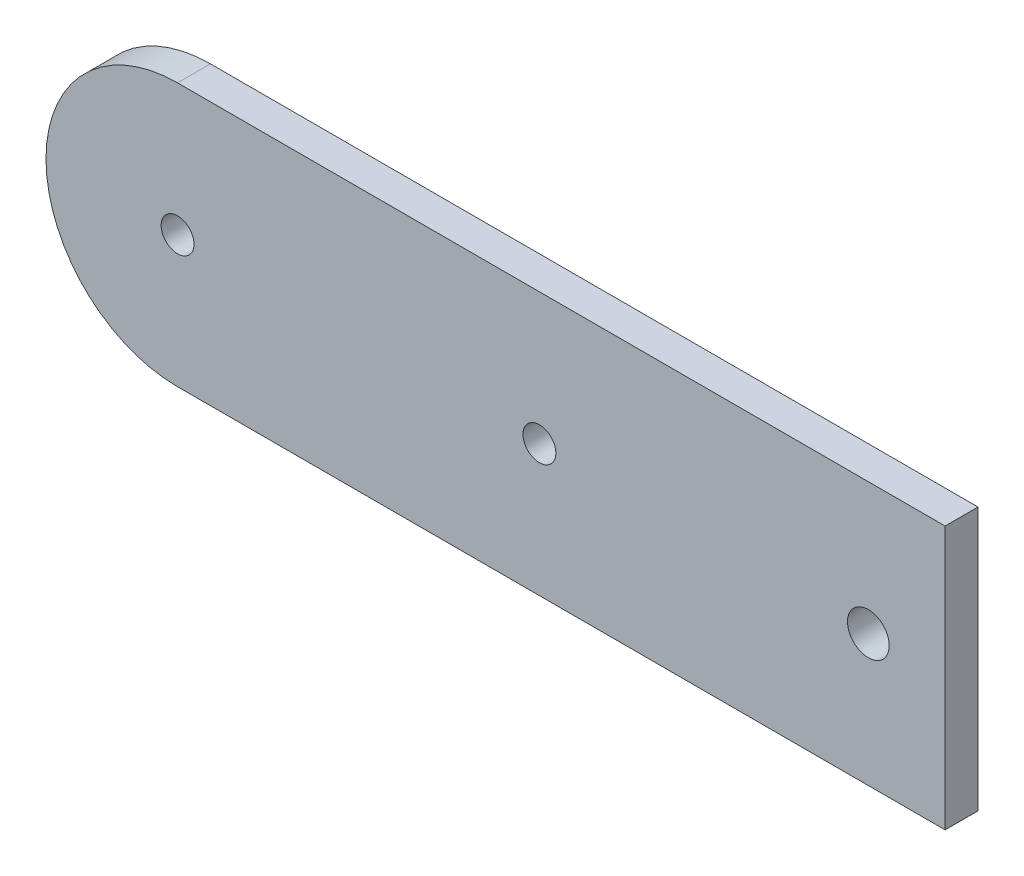
ISO-10303-21;
HEADER;
FILE_DESCRIPTION(('STEP AP214'),'2;1');
FILE_NAME('part.step','',(''),(''),'','','');
FILE_SCHEMA(('AUTOMOTIVE_DESIGN { 1 0 10303 214 1 1 1 1 }'));
ENDSEC;
DATA;
#1=APPLICATION_CONTEXT('core data for automotive mechanical design processes');
#2=APPLICATION_PROTOCOL_DEFINITION('international standard','automotive_design',2000,#1);
#3=PRODUCT_CONTEXT('',#1,'mechanical');
#4=PRODUCT('Part','Part','',(#3));
#5=PRODUCT_RELATED_PRODUCT_CATEGORY('part','',(#4));
#6=PRODUCT_DEFINITION_FORMATION('','',#4);
#7=PRODUCT_DEFINITION_CONTEXT('part definition',#1,'design');
#8=PRODUCT_DEFINITION('design','',#6,#7);
#9=PRODUCT_DEFINITION_SHAPE('','',#8);
#10=(LENGTH_UNIT() NAMED_UNIT(*) SI_UNIT(.MILLI.,.METRE.));
#11=(NAMED_UNIT(*) PLANE_ANGLE_UNIT() SI_UNIT($,.RADIAN.));
#12=(NAMED_UNIT(*) SI_UNIT($,.STERADIAN.) SOLID_ANGLE_UNIT());
#13=UNCERTAINTY_MEASURE_WITH_UNIT(LENGTH_MEASURE(1.E-05),#10,'distance_accuracy_value','');
#14=(GEOMETRIC_REPRESENTATION_CONTEXT(3) GLOBAL_UNCERTAINTY_ASSIGNED_CONTEXT((#13)) GLOBAL_UNIT_ASSIGNED_CONTEXT((#10,
#11,#12)) REPRESENTATION_CONTEXT('',''));
#15=CARTESIAN_POINT('',(0.,0.,0.));
#16=DIRECTION('',(0.,0.,1.));
#17=DIRECTION('',(1.,0.,0.));
#18=AXIS2_PLACEMENT_3D('',#15,#16,#17);
#19=CARTESIAN_POINT('',(-70.,0.,3.));
#20=DIRECTION('',(0.,0.,1.));
#21=DIRECTION('',(1.,0.,0.));
#22=AXIS2_PLACEMENT_3D('',#19,#20,#21);
#23=PLANE('',#22);
#24=CARTESIAN_POINT('',(-37.,0.,3.));
#25=DIRECTION('',(0.,0.,1.));
#26=DIRECTION('',(1.,0.,0.));
#27=AXIS2_PLACEMENT_3D('',#24,#25,#26);
#28=CIRCLE('',#27,1.5);
#29=CARTESIAN_POINT('',(-35.5,0.,3.));
#30=VERTEX_POINT('',#29);
#31=EDGE_CURVE('E134',#30,#30,#28,.T.);
#32=ORIENTED_EDGE('',*,*,#31,.F.);
#33=EDGE_LOOP('',(#32));
#34=FACE_BOUND('',#33,.T.);
#35=CARTESIAN_POINT('',(-70.,0.,3.));
#36=DIRECTION('',(0.,0.,1.));
#37=DIRECTION('',(1.,0.,0.));
#38=AXIS2_PLACEMENT_3D('',#35,#36,#37);
#39=CIRCLE('',#38,12.);
#40=CARTESIAN_POINT('',(-70.,12.,3.));
#41=VERTEX_POINT('',#40);
#42=CARTESIAN_POINT('',(-70.,-12.,3.));
#43=VERTEX_POINT('',#42);
#44=EDGE_CURVE('E92',#41,#43,#39,.T.);
#45=ORIENTED_EDGE('',*,*,#44,.T.);
#46=DIRECTION('',(1.,0.,0.));
#47=VECTOR('',#46,1.);
#48=CARTESIAN_POINT('',(-70.,-12.,3.));
#49=LINE('',#48,#47);
#50=CARTESIAN_POINT('',(0.,-12.,3.));
#51=VERTEX_POINT('',#50);
#52=EDGE_CURVE('E87',#43,#51,#49,.T.);
#53=ORIENTED_EDGE('',*,*,#52,.T.);
#54=DIRECTION('',(0.,1.,0.));
#55=VECTOR('',#54,1.);
#56=CARTESIAN_POINT('',(0.,12.,3.));
#57=LINE('',#56,#55);
#58=CARTESIAN_POINT('',(0.,12.,3.));
#59=VERTEX_POINT('',#58);
#60=EDGE_CURVE('E90',#51,#59,#57,.T.);
#61=ORIENTED_EDGE('',*,*,#60,.T.);
#62=DIRECTION('',(-1.,0.,0.));
#63=VECTOR('',#62,1.);
#64=CARTESIAN_POINT('',(-70.,12.,3.));
#65=LINE('',#64,#63);
#66=EDGE_CURVE('E57',#59,#41,#65,.T.);
#67=ORIENTED_EDGE('',*,*,#66,.T.);
#68=EDGE_LOOP('',(#45,#53,#61,#67));
#69=FACE_BOUND('',#68,.T.);
#70=CARTESIAN_POINT('',(-70.,0.,3.));
#71=DIRECTION('',(0.,0.,1.));
#72=DIRECTION('',(1.,0.,0.));
#73=AXIS2_PLACEMENT_3D('',#70,#71,#72);
#74=CIRCLE('',#73,1.5);
#75=CARTESIAN_POINT('',(-68.5,0.,3.));
#76=VERTEX_POINT('',#75);
#77=EDGE_CURVE('E112',#76,#76,#74,.T.);
#78=ORIENTED_EDGE('',*,*,#77,.F.);
#79=EDGE_LOOP('',(#78));
#80=FACE_BOUND('',#79,.T.);
#81=CARTESIAN_POINT('',(-7.,0.,3.));
#82=DIRECTION('',(0.,0.,1.));
#83=DIRECTION('',(1.,0.,0.));
#84=AXIS2_PLACEMENT_3D('',#81,#82,#83);
#85=CIRCLE('',#84,1.90238919097051);
#86=CARTESIAN_POINT('',(-5.09761080902949,0.,3.));
#87=VERTEX_POINT('',#86);
#88=EDGE_CURVE('E142',#87,#87,#85,.T.);
#89=ORIENTED_EDGE('',*,*,#88,.F.);
#90=EDGE_LOOP('',(#89));
#91=FACE_BOUND('',#90,.T.);
#92=ADVANCED_FACE('F39',(#34,#69,#80,#91),#23,.T.);
#93=CARTESIAN_POINT('',(-70.,0.,0.));
#94=DIRECTION('',(0.,0.,1.));
#95=DIRECTION('',(1.,0.,0.));
#96=AXIS2_PLACEMENT_3D('',#93,#94,#95);
#97=PLANE('',#96);
#98=CARTESIAN_POINT('',(-70.,0.,0.));
#99=DIRECTION('',(0.,0.,1.));
#100=DIRECTION('',(1.,0.,0.));
#101=AXIS2_PLACEMENT_3D('',#98,#99,#100);
#102=CIRCLE('',#101,12.);
#103=CARTESIAN_POINT('',(-70.,12.,0.));
#104=VERTEX_POINT('',#103);
#105=CARTESIAN_POINT('',(-70.,-12.,0.));
#106=VERTEX_POINT('',#105);
#107=EDGE_CURVE('E108',#104,#106,#102,.T.);
#108=ORIENTED_EDGE('',*,*,#107,.F.);
#109=DIRECTION('',(-1.,0.,0.));
#110=VECTOR('',#109,1.);
#111=CARTESIAN_POINT('',(-70.,12.,0.));
#112=LINE('',#111,#110);
#113=CARTESIAN_POINT('',(0.,12.,0.));
#114=VERTEX_POINT('',#113);
#115=EDGE_CURVE('E80',#114,#104,#112,.T.);
#116=ORIENTED_EDGE('',*,*,#115,.F.);
#117=DIRECTION('',(0.,1.,0.));
#118=VECTOR('',#117,1.);
#119=CARTESIAN_POINT('',(0.,12.,0.));
#120=LINE('',#119,#118);
#121=CARTESIAN_POINT('',(0.,-12.,0.));
#122=VERTEX_POINT('',#121);
#123=EDGE_CURVE('E74',#122,#114,#120,.T.);
#124=ORIENTED_EDGE('',*,*,#123,.F.);
#125=DIRECTION('',(1.,0.,0.));
#126=VECTOR('',#125,1.);
#127=CARTESIAN_POINT('',(-70.,-12.,0.));
#128=LINE('',#127,#126);
#129=EDGE_CURVE('E97',#106,#122,#128,.T.);
#130=ORIENTED_EDGE('',*,*,#129,.F.);
#131=EDGE_LOOP('',(#108,#116,#124,#130));
#132=FACE_BOUND('',#131,.T.);
#133=CARTESIAN_POINT('',(-70.,0.,0.));
#134=DIRECTION('',(0.,0.,1.));
#135=DIRECTION('',(1.,0.,0.));
#136=AXIS2_PLACEMENT_3D('',#133,#134,#135);
#137=CIRCLE('',#136,1.5);
#138=CARTESIAN_POINT('',(-68.5,0.,0.));
#139=VERTEX_POINT('',#138);
#140=EDGE_CURVE('E130',#139,#139,#137,.T.);
#141=ORIENTED_EDGE('',*,*,#140,.T.);
#142=EDGE_LOOP('',(#141));
#143=FACE_BOUND('',#142,.T.);
#144=CARTESIAN_POINT('',(-37.,0.,0.));
#145=DIRECTION('',(0.,0.,1.));
#146=DIRECTION('',(1.,0.,0.));
#147=AXIS2_PLACEMENT_3D('',#144,#145,#146);
#148=CIRCLE('',#147,1.5);
#149=CARTESIAN_POINT('',(-35.5,0.,0.));
#150=VERTEX_POINT('',#149);
#151=EDGE_CURVE('E138',#150,#150,#148,.T.);
#152=ORIENTED_EDGE('',*,*,#151,.T.);
#153=EDGE_LOOP('',(#152));
#154=FACE_BOUND('',#153,.T.);
#155=CARTESIAN_POINT('',(-7.,0.,0.));
#156=DIRECTION('',(0.,0.,1.));
#157=DIRECTION('',(1.,0.,0.));
#158=AXIS2_PLACEMENT_3D('',#155,#156,#157);
#159=CIRCLE('',#158,1.90238919097051);
#160=CARTESIAN_POINT('',(-5.09761080902949,0.,0.));
#161=VERTEX_POINT('',#160);
#162=EDGE_CURVE('E146',#161,#161,#159,.T.);
#163=ORIENTED_EDGE('',*,*,#162,.T.);
#164=EDGE_LOOP('',(#163));
#165=FACE_BOUND('',#164,.T.);
#166=ADVANCED_FACE('F125',(#132,#143,#154,#165),#97,.F.);
#167=CARTESIAN_POINT('',(-70.,0.,3.));
#168=DIRECTION('',(0.,0.,-1.));
#169=DIRECTION('',(-1.,0.,0.));
#170=AXIS2_PLACEMENT_3D('',#167,#168,#169);
#171=CYLINDRICAL_SURFACE('',#170,12.);
#172=ORIENTED_EDGE('',*,*,#107,.T.);
#173=DIRECTION('',(0.,0.,-1.));
#174=VECTOR('',#173,1.);
#175=CARTESIAN_POINT('',(-70.,-12.,3.));
#176=LINE('',#175,#174);
#177=EDGE_CURVE('E11',#43,#106,#176,.T.);
#178=ORIENTED_EDGE('',*,*,#177,.F.);
#179=ORIENTED_EDGE('',*,*,#44,.F.);
#180=DIRECTION('',(0.,0.,-1.));
#181=VECTOR('',#180,1.);
#182=CARTESIAN_POINT('',(-70.,12.,3.));
#183=LINE('',#182,#181);
#184=EDGE_CURVE('E104',#41,#104,#183,.T.);
#185=ORIENTED_EDGE('',*,*,#184,.T.);
#186=EDGE_LOOP('',(#172,#178,#179,#185));
#187=FACE_BOUND('',#186,.T.);
#188=ADVANCED_FACE('F41',(#187),#171,.T.);
#189=CARTESIAN_POINT('',(-70.,-12.,3.));
#190=DIRECTION('',(0.,1.,0.));
#191=DIRECTION('',(0.,0.,1.));
#192=AXIS2_PLACEMENT_3D('',#189,#190,#191);
#193=PLANE('',#192);
#194=ORIENTED_EDGE('',*,*,#129,.T.);
#195=DIRECTION('',(0.,0.,-1.));
#196=VECTOR('',#195,1.);
#197=CARTESIAN_POINT('',(0.,-12.,3.));
#198=LINE('',#197,#196);
#199=EDGE_CURVE('E49',#51,#122,#198,.T.);
#200=ORIENTED_EDGE('',*,*,#199,.F.);
#201=ORIENTED_EDGE('',*,*,#52,.F.);
#202=ORIENTED_EDGE('',*,*,#177,.T.);
#203=EDGE_LOOP('',(#194,#200,#201,#202));
#204=FACE_BOUND('',#203,.T.);
#205=ADVANCED_FACE('F96',(#204),#193,.F.);
#206=CARTESIAN_POINT('',(0.,12.,3.));
#207=DIRECTION('',(-1.,0.,0.));
#208=DIRECTION('',(0.,0.,1.));
#209=AXIS2_PLACEMENT_3D('',#206,#207,#208);
#210=PLANE('',#209);
#211=ORIENTED_EDGE('',*,*,#123,.T.);
#212=DIRECTION('',(0.,0.,-1.));
#213=VECTOR('',#212,1.);
#214=CARTESIAN_POINT('',(0.,12.,3.));
#215=LINE('',#214,#213);
#216=EDGE_CURVE('E99',#59,#114,#215,.T.);
#217=ORIENTED_EDGE('',*,*,#216,.F.);
#218=ORIENTED_EDGE('',*,*,#60,.F.);
#219=ORIENTED_EDGE('',*,*,#199,.T.);
#220=EDGE_LOOP('',(#211,#217,#218,#219));
#221=FACE_BOUND('',#220,.T.);
#222=ADVANCED_FACE('F100',(#221),#210,.F.);
#223=CARTESIAN_POINT('',(-70.,12.,3.));
#224=DIRECTION('',(0.,-1.,0.));
#225=DIRECTION('',(0.,0.,-1.));
#226=AXIS2_PLACEMENT_3D('',#223,#224,#225);
#227=PLANE('',#226);
#228=ORIENTED_EDGE('',*,*,#115,.T.);
#229=ORIENTED_EDGE('',*,*,#184,.F.);
#230=ORIENTED_EDGE('',*,*,#66,.F.);
#231=ORIENTED_EDGE('',*,*,#216,.T.);
#232=EDGE_LOOP('',(#228,#229,#230,#231));
#233=FACE_BOUND('',#232,.T.);
#234=ADVANCED_FACE('F122',(#233),#227,.F.);
#235=CARTESIAN_POINT('',(-70.,0.,3.));
#236=DIRECTION('',(0.,0.,-1.));
#237=DIRECTION('',(-1.,0.,0.));
#238=AXIS2_PLACEMENT_3D('',#235,#236,#237);
#239=CYLINDRICAL_SURFACE('',#238,1.5);
#240=ORIENTED_EDGE('',*,*,#77,.T.);
#241=EDGE_LOOP('',(#240));
#242=FACE_BOUND('',#241,.T.);
#243=ORIENTED_EDGE('',*,*,#140,.F.);
#244=EDGE_LOOP('',(#243));
#245=FACE_BOUND('',#244,.T.);
#246=ADVANCED_FACE('F166',(#242,#245),#239,.F.);
#247=CARTESIAN_POINT('',(-37.,0.,3.));
#248=DIRECTION('',(0.,0.,-1.));
#249=DIRECTION('',(-1.,0.,0.));
#250=AXIS2_PLACEMENT_3D('',#247,#248,#249);
#251=CYLINDRICAL_SURFACE('',#250,1.5);
#252=ORIENTED_EDGE('',*,*,#31,.T.);
#253=EDGE_LOOP('',(#252));
#254=FACE_BOUND('',#253,.T.);
#255=ORIENTED_EDGE('',*,*,#151,.F.);
#256=EDGE_LOOP('',(#255));
#257=FACE_BOUND('',#256,.T.);
#258=ADVANCED_FACE('F212',(#254,#257),#251,.F.);
#259=CARTESIAN_POINT('',(-7.,0.,3.));
#260=DIRECTION('',(0.,0.,-1.));
#261=DIRECTION('',(-1.,0.,0.));
#262=AXIS2_PLACEMENT_3D('',#259,#260,#261);
#263=CYLINDRICAL_SURFACE('',#262,1.90238919097051);
#264=ORIENTED_EDGE('',*,*,#88,.T.);
#265=EDGE_LOOP('',(#264));
#266=FACE_BOUND('',#265,.T.);
#267=ORIENTED_EDGE('',*,*,#162,.F.);
#268=EDGE_LOOP('',(#267));
#269=FACE_BOUND('',#268,.T.);
#270=ADVANCED_FACE('F154',(#266,#269),#263,.F.);
#271=CLOSED_SHELL('',(#92,#166,#188,#205,#222,#234,#246,#258,#270));
#272=MANIFOLD_SOLID_BREP('B2',#271);
#273=ADVANCED_BREP_SHAPE_REPRESENTATION('',(#18,#272),#14);
#274=SHAPE_DEFINITION_REPRESENTATION(#9,#273);
ENDSEC;
END-ISO-10303-21;
